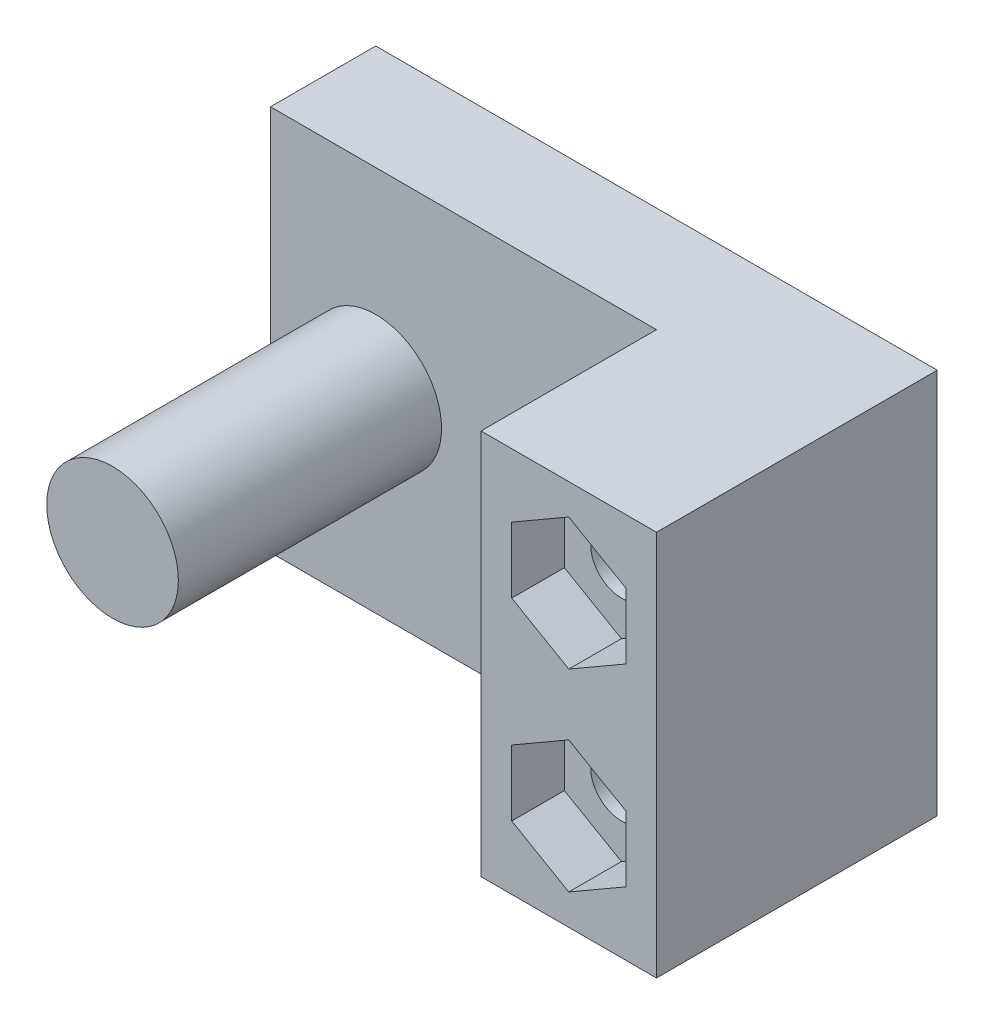
ISO-10303-21;
HEADER;
FILE_DESCRIPTION(('STEP AP214'),'2;1');
FILE_NAME('part.step','',(''),(''),'','','');
FILE_SCHEMA(('AUTOMOTIVE_DESIGN { 1 0 10303 214 1 1 1 1 }'));
ENDSEC;
DATA;
#1=APPLICATION_CONTEXT('core data for automotive mechanical design processes');
#2=APPLICATION_PROTOCOL_DEFINITION('international standard','automotive_design',2000,#1);
#3=PRODUCT_CONTEXT('',#1,'mechanical');
#4=PRODUCT('Part','Part','',(#3));
#5=PRODUCT_RELATED_PRODUCT_CATEGORY('part','',(#4));
#6=PRODUCT_DEFINITION_FORMATION('','',#4);
#7=PRODUCT_DEFINITION_CONTEXT('part definition',#1,'design');
#8=PRODUCT_DEFINITION('design','',#6,#7);
#9=PRODUCT_DEFINITION_SHAPE('','',#8);
#10=(LENGTH_UNIT() NAMED_UNIT(*) SI_UNIT(.MILLI.,.METRE.));
#11=(NAMED_UNIT(*) PLANE_ANGLE_UNIT() SI_UNIT($,.RADIAN.));
#12=(NAMED_UNIT(*) SI_UNIT($,.STERADIAN.) SOLID_ANGLE_UNIT());
#13=UNCERTAINTY_MEASURE_WITH_UNIT(LENGTH_MEASURE(1.E-05),#10,'distance_accuracy_value','');
#14=(GEOMETRIC_REPRESENTATION_CONTEXT(3) GLOBAL_UNCERTAINTY_ASSIGNED_CONTEXT((#13)) GLOBAL_UNIT_ASSIGNED_CONTEXT((#10,
#11,#12)) REPRESENTATION_CONTEXT('',''));
#15=CARTESIAN_POINT('',(0.,0.,0.));
#16=DIRECTION('',(0.,0.,1.));
#17=DIRECTION('',(1.,0.,0.));
#18=AXIS2_PLACEMENT_3D('',#15,#16,#17);
#19=CARTESIAN_POINT('',(13.,22.,6.));
#20=DIRECTION('',(0.,0.,-1.));
#21=DIRECTION('',(-1.,0.,0.));
#22=AXIS2_PLACEMENT_3D('',#19,#20,#21);
#23=PLANE('',#22);
#24=DIRECTION('',(1.,0.,0.));
#25=VECTOR('',#24,1.);
#26=CARTESIAN_POINT('',(13.,0.,6.));
#27=LINE('',#26,#25);
#28=CARTESIAN_POINT('',(-9.,0.,6.));
#29=VERTEX_POINT('',#28);
#30=CARTESIAN_POINT('',(13.,0.,6.));
#31=VERTEX_POINT('',#30);
#32=EDGE_CURVE('E293',#29,#31,#27,.T.);
#33=ORIENTED_EDGE('',*,*,#32,.T.);
#34=DIRECTION('',(0.,-1.,0.));
#35=VECTOR('',#34,1.);
#36=CARTESIAN_POINT('',(13.,22.,6.));
#37=LINE('',#36,#35);
#38=CARTESIAN_POINT('',(13.,22.,6.));
#39=VERTEX_POINT('',#38);
#40=EDGE_CURVE('E303',#39,#31,#37,.T.);
#41=ORIENTED_EDGE('',*,*,#40,.F.);
#42=DIRECTION('',(1.,0.,0.));
#43=VECTOR('',#42,1.);
#44=CARTESIAN_POINT('',(13.,22.,6.));
#45=LINE('',#44,#43);
#46=CARTESIAN_POINT('',(-9.,22.,6.));
#47=VERTEX_POINT('',#46);
#48=EDGE_CURVE('E280',#47,#39,#45,.T.);
#49=ORIENTED_EDGE('',*,*,#48,.F.);
#50=DIRECTION('',(0.,-1.,0.));
#51=VECTOR('',#50,1.);
#52=CARTESIAN_POINT('',(-9.,22.,6.));
#53=LINE('',#52,#51);
#54=EDGE_CURVE('E306',#47,#29,#53,.T.);
#55=ORIENTED_EDGE('',*,*,#54,.T.);
#56=EDGE_LOOP('',(#33,#41,#49,#55));
#57=FACE_BOUND('',#56,.T.);
#58=CARTESIAN_POINT('',(-3.,11.,6.));
#59=DIRECTION('',(0.,0.,-1.));
#60=DIRECTION('',(-1.,0.,0.));
#61=AXIS2_PLACEMENT_3D('',#58,#59,#60);
#62=CIRCLE('',#61,3.75);
#63=CARTESIAN_POINT('',(-6.75,11.,6.));
#64=VERTEX_POINT('',#63);
#65=EDGE_CURVE('E11',#64,#64,#62,.F.);
#66=ORIENTED_EDGE('',*,*,#65,.F.);
#67=EDGE_LOOP('',(#66));
#68=FACE_BOUND('',#67,.T.);
#69=ADVANCED_FACE('F33',(#57,#68),#23,.F.);
#70=CARTESIAN_POINT('',(23.,22.,0.));
#71=DIRECTION('',(-1.,0.,0.));
#72=DIRECTION('',(0.,0.,1.));
#73=AXIS2_PLACEMENT_3D('',#70,#71,#72);
#74=PLANE('',#73);
#75=DIRECTION('',(0.,0.,-1.));
#76=VECTOR('',#75,1.);
#77=CARTESIAN_POINT('',(23.,0.,0.));
#78=LINE('',#77,#76);
#79=CARTESIAN_POINT('',(23.,0.,16.));
#80=VERTEX_POINT('',#79);
#81=CARTESIAN_POINT('',(23.,0.,0.));
#82=VERTEX_POINT('',#81);
#83=EDGE_CURVE('E271',#80,#82,#78,.T.);
#84=ORIENTED_EDGE('',*,*,#83,.T.);
#85=DIRECTION('',(0.,-1.,0.));
#86=VECTOR('',#85,1.);
#87=CARTESIAN_POINT('',(23.,22.,0.));
#88=LINE('',#87,#86);
#89=CARTESIAN_POINT('',(23.,22.,0.));
#90=VERTEX_POINT('',#89);
#91=EDGE_CURVE('E42',#90,#82,#88,.T.);
#92=ORIENTED_EDGE('',*,*,#91,.F.);
#93=DIRECTION('',(0.,0.,-1.));
#94=VECTOR('',#93,1.);
#95=CARTESIAN_POINT('',(23.,22.,0.));
#96=LINE('',#95,#94);
#97=CARTESIAN_POINT('',(23.,22.,16.));
#98=VERTEX_POINT('',#97);
#99=EDGE_CURVE('E272',#98,#90,#96,.T.);
#100=ORIENTED_EDGE('',*,*,#99,.F.);
#101=DIRECTION('',(0.,-1.,0.));
#102=VECTOR('',#101,1.);
#103=CARTESIAN_POINT('',(23.,22.,16.));
#104=LINE('',#103,#102);
#105=EDGE_CURVE('E286',#98,#80,#104,.T.);
#106=ORIENTED_EDGE('',*,*,#105,.T.);
#107=EDGE_LOOP('',(#84,#92,#100,#106));
#108=FACE_BOUND('',#107,.T.);
#109=ADVANCED_FACE('F35',(#108),#74,.F.);
#110=CARTESIAN_POINT('',(23.,22.,0.));
#111=DIRECTION('',(0.,0.,1.));
#112=DIRECTION('',(1.,0.,0.));
#113=AXIS2_PLACEMENT_3D('',#110,#111,#112);
#114=PLANE('',#113);
#115=DIRECTION('',(-1.,0.,0.));
#116=VECTOR('',#115,1.);
#117=CARTESIAN_POINT('',(23.,0.,0.));
#118=LINE('',#117,#116);
#119=CARTESIAN_POINT('',(-9.,0.,0.));
#120=VERTEX_POINT('',#119);
#121=EDGE_CURVE('E289',#82,#120,#118,.T.);
#122=ORIENTED_EDGE('',*,*,#121,.T.);
#123=DIRECTION('',(0.,-1.,0.));
#124=VECTOR('',#123,1.);
#125=CARTESIAN_POINT('',(-9.,22.,0.));
#126=LINE('',#125,#124);
#127=CARTESIAN_POINT('',(-9.,22.,0.));
#128=VERTEX_POINT('',#127);
#129=EDGE_CURVE('E309',#128,#120,#126,.T.);
#130=ORIENTED_EDGE('',*,*,#129,.F.);
#131=DIRECTION('',(-1.,0.,0.));
#132=VECTOR('',#131,1.);
#133=CARTESIAN_POINT('',(23.,22.,0.));
#134=LINE('',#133,#132);
#135=EDGE_CURVE('E275',#90,#128,#134,.T.);
#136=ORIENTED_EDGE('',*,*,#135,.F.);
#137=ORIENTED_EDGE('',*,*,#91,.T.);
#138=EDGE_LOOP('',(#122,#130,#136,#137));
#139=FACE_BOUND('',#138,.T.);
#140=ADVANCED_FACE('F339',(#139),#114,.F.);
#141=CARTESIAN_POINT('',(-9.,22.,0.));
#142=DIRECTION('',(1.,0.,0.));
#143=DIRECTION('',(0.,0.,-1.));
#144=AXIS2_PLACEMENT_3D('',#141,#142,#143);
#145=PLANE('',#144);
#146=DIRECTION('',(0.,0.,1.));
#147=VECTOR('',#146,1.);
#148=CARTESIAN_POINT('',(-9.,0.,0.));
#149=LINE('',#148,#147);
#150=EDGE_CURVE('E291',#120,#29,#149,.T.);
#151=ORIENTED_EDGE('',*,*,#150,.T.);
#152=ORIENTED_EDGE('',*,*,#54,.F.);
#153=DIRECTION('',(0.,0.,1.));
#154=VECTOR('',#153,1.);
#155=CARTESIAN_POINT('',(-9.,22.,0.));
#156=LINE('',#155,#154);
#157=EDGE_CURVE('E278',#128,#47,#156,.T.);
#158=ORIENTED_EDGE('',*,*,#157,.F.);
#159=ORIENTED_EDGE('',*,*,#129,.T.);
#160=EDGE_LOOP('',(#151,#152,#158,#159));
#161=FACE_BOUND('',#160,.T.);
#162=ADVANCED_FACE('F346',(#161),#145,.F.);
#163=CARTESIAN_POINT('',(13.,22.,16.));
#164=DIRECTION('',(1.,0.,0.));
#165=DIRECTION('',(0.,0.,-1.));
#166=AXIS2_PLACEMENT_3D('',#163,#164,#165);
#167=PLANE('',#166);
#168=DIRECTION('',(0.,0.,1.));
#169=VECTOR('',#168,1.);
#170=CARTESIAN_POINT('',(13.,0.,16.));
#171=LINE('',#170,#169);
#172=CARTESIAN_POINT('',(13.,0.,16.));
#173=VERTEX_POINT('',#172);
#174=EDGE_CURVE('E295',#31,#173,#171,.T.);
#175=ORIENTED_EDGE('',*,*,#174,.T.);
#176=DIRECTION('',(0.,-1.,0.));
#177=VECTOR('',#176,1.);
#178=CARTESIAN_POINT('',(13.,22.,16.));
#179=LINE('',#178,#177);
#180=CARTESIAN_POINT('',(13.,22.,16.));
#181=VERTEX_POINT('',#180);
#182=EDGE_CURVE('E300',#181,#173,#179,.T.);
#183=ORIENTED_EDGE('',*,*,#182,.F.);
#184=DIRECTION('',(0.,0.,1.));
#185=VECTOR('',#184,1.);
#186=CARTESIAN_POINT('',(13.,22.,16.));
#187=LINE('',#186,#185);
#188=EDGE_CURVE('E282',#39,#181,#187,.T.);
#189=ORIENTED_EDGE('',*,*,#188,.F.);
#190=ORIENTED_EDGE('',*,*,#40,.T.);
#191=EDGE_LOOP('',(#175,#183,#189,#190));
#192=FACE_BOUND('',#191,.T.);
#193=ADVANCED_FACE('F344',(#192),#167,.F.);
#194=CARTESIAN_POINT('',(23.,22.,16.));
#195=DIRECTION('',(0.,0.,-1.));
#196=DIRECTION('',(-1.,0.,0.));
#197=AXIS2_PLACEMENT_3D('',#194,#195,#196);
#198=PLANE('',#197);
#199=DIRECTION('',(0.,1.,0.));
#200=VECTOR('',#199,1.);
#201=CARTESIAN_POINT('',(21.25,3.62361162513372,16.));
#202=LINE('',#201,#200);
#203=CARTESIAN_POINT('',(21.25,3.62361162513372,16.));
#204=VERTEX_POINT('',#203);
#205=CARTESIAN_POINT('',(21.25,7.37638837486628,16.));
#206=VERTEX_POINT('',#205);
#207=EDGE_CURVE('E196',#204,#206,#202,.T.);
#208=ORIENTED_EDGE('',*,*,#207,.F.);
#209=DIRECTION('',(0.866025403784438,0.5,0.));
#210=VECTOR('',#209,1.);
#211=CARTESIAN_POINT('',(18.,1.74722325026744,16.));
#212=LINE('',#211,#210);
#213=CARTESIAN_POINT('',(18.,1.74722325026744,16.));
#214=VERTEX_POINT('',#213);
#215=EDGE_CURVE('E50',#214,#204,#212,.T.);
#216=ORIENTED_EDGE('',*,*,#215,.F.);
#217=DIRECTION('',(0.866025403784439,-0.5,0.));
#218=VECTOR('',#217,1.);
#219=CARTESIAN_POINT('',(14.75,3.62361162513372,16.));
#220=LINE('',#219,#218);
#221=CARTESIAN_POINT('',(14.75,3.62361162513372,16.));
#222=VERTEX_POINT('',#221);
#223=EDGE_CURVE('E182',#222,#214,#220,.T.);
#224=ORIENTED_EDGE('',*,*,#223,.F.);
#225=DIRECTION('',(0.,-1.,0.));
#226=VECTOR('',#225,1.);
#227=CARTESIAN_POINT('',(14.75,7.37638837486628,16.));
#228=LINE('',#227,#226);
#229=CARTESIAN_POINT('',(14.75,7.37638837486628,16.));
#230=VERTEX_POINT('',#229);
#231=EDGE_CURVE('E185',#230,#222,#228,.T.);
#232=ORIENTED_EDGE('',*,*,#231,.F.);
#233=DIRECTION('',(-0.866025403784438,-0.5,0.));
#234=VECTOR('',#233,1.);
#235=CARTESIAN_POINT('',(18.,9.25277674973256,16.));
#236=LINE('',#235,#234);
#237=CARTESIAN_POINT('',(18.,9.25277674973256,16.));
#238=VERTEX_POINT('',#237);
#239=EDGE_CURVE('E201',#238,#230,#236,.T.);
#240=ORIENTED_EDGE('',*,*,#239,.F.);
#241=DIRECTION('',(-0.866025403784439,0.5,0.));
#242=VECTOR('',#241,1.);
#243=CARTESIAN_POINT('',(21.25,7.37638837486628,16.));
#244=LINE('',#243,#242);
#245=EDGE_CURVE('E198',#206,#238,#244,.T.);
#246=ORIENTED_EDGE('',*,*,#245,.F.);
#247=EDGE_LOOP('',(#208,#216,#224,#232,#240,#246));
#248=FACE_BOUND('',#247,.T.);
#249=DIRECTION('',(0.,1.,0.));
#250=VECTOR('',#249,1.);
#251=CARTESIAN_POINT('',(21.25,14.6236116251337,16.));
#252=LINE('',#251,#250);
#253=CARTESIAN_POINT('',(21.25,14.6236116251337,16.));
#254=VERTEX_POINT('',#253);
#255=CARTESIAN_POINT('',(21.25,18.3763883748663,16.));
#256=VERTEX_POINT('',#255);
#257=EDGE_CURVE('E236',#254,#256,#252,.T.);
#258=ORIENTED_EDGE('',*,*,#257,.F.);
#259=DIRECTION('',(0.866025403784439,0.5,0.));
#260=VECTOR('',#259,1.);
#261=CARTESIAN_POINT('',(18.,12.7472232502674,16.));
#262=LINE('',#261,#260);
#263=CARTESIAN_POINT('',(18.,12.7472232502674,16.));
#264=VERTEX_POINT('',#263);
#265=EDGE_CURVE('E58',#264,#254,#262,.T.);
#266=ORIENTED_EDGE('',*,*,#265,.F.);
#267=DIRECTION('',(0.866025403784439,-0.5,0.));
#268=VECTOR('',#267,1.);
#269=CARTESIAN_POINT('',(14.75,14.6236116251337,16.));
#270=LINE('',#269,#268);
#271=CARTESIAN_POINT('',(14.75,14.6236116251337,16.));
#272=VERTEX_POINT('',#271);
#273=EDGE_CURVE('E219',#272,#264,#270,.T.);
#274=ORIENTED_EDGE('',*,*,#273,.F.);
#275=DIRECTION('',(0.,-1.,0.));
#276=VECTOR('',#275,1.);
#277=CARTESIAN_POINT('',(14.75,18.3763883748663,16.));
#278=LINE('',#277,#276);
#279=CARTESIAN_POINT('',(14.75,18.3763883748663,16.));
#280=VERTEX_POINT('',#279);
#281=EDGE_CURVE('E245',#280,#272,#278,.T.);
#282=ORIENTED_EDGE('',*,*,#281,.F.);
#283=DIRECTION('',(-0.866025403784439,-0.5,0.));
#284=VECTOR('',#283,1.);
#285=CARTESIAN_POINT('',(18.,20.2527767497326,16.));
#286=LINE('',#285,#284);
#287=CARTESIAN_POINT('',(18.,20.2527767497326,16.));
#288=VERTEX_POINT('',#287);
#289=EDGE_CURVE('E242',#288,#280,#286,.T.);
#290=ORIENTED_EDGE('',*,*,#289,.F.);
#291=DIRECTION('',(-0.866025403784439,0.499999999999999,0.));
#292=VECTOR('',#291,1.);
#293=CARTESIAN_POINT('',(21.25,18.3763883748663,16.));
#294=LINE('',#293,#292);
#295=EDGE_CURVE('E239',#256,#288,#294,.T.);
#296=ORIENTED_EDGE('',*,*,#295,.F.);
#297=EDGE_LOOP('',(#258,#266,#274,#282,#290,#296));
#298=FACE_BOUND('',#297,.T.);
#299=DIRECTION('',(1.,0.,0.));
#300=VECTOR('',#299,1.);
#301=CARTESIAN_POINT('',(23.,0.,16.));
#302=LINE('',#301,#300);
#303=EDGE_CURVE('E276',#173,#80,#302,.T.);
#304=ORIENTED_EDGE('',*,*,#303,.T.);
#305=ORIENTED_EDGE('',*,*,#105,.F.);
#306=DIRECTION('',(1.,0.,0.));
#307=VECTOR('',#306,1.);
#308=CARTESIAN_POINT('',(23.,22.,16.));
#309=LINE('',#308,#307);
#310=EDGE_CURVE('E284',#181,#98,#309,.T.);
#311=ORIENTED_EDGE('',*,*,#310,.F.);
#312=ORIENTED_EDGE('',*,*,#182,.T.);
#313=EDGE_LOOP('',(#304,#305,#311,#312));
#314=FACE_BOUND('',#313,.T.);
#315=ADVANCED_FACE('F375',(#248,#298,#314),#198,.F.);
#316=CARTESIAN_POINT('',(0.,22.,0.));
#317=DIRECTION('',(0.,-1.,0.));
#318=DIRECTION('',(0.,0.,-1.));
#319=AXIS2_PLACEMENT_3D('',#316,#317,#318);
#320=PLANE('',#319);
#321=ORIENTED_EDGE('',*,*,#99,.T.);
#322=ORIENTED_EDGE('',*,*,#135,.T.);
#323=ORIENTED_EDGE('',*,*,#157,.T.);
#324=ORIENTED_EDGE('',*,*,#48,.T.);
#325=ORIENTED_EDGE('',*,*,#188,.T.);
#326=ORIENTED_EDGE('',*,*,#310,.T.);
#327=EDGE_LOOP('',(#321,#322,#323,#324,#325,#326));
#328=FACE_BOUND('',#327,.T.);
#329=ADVANCED_FACE('F371',(#328),#320,.F.);
#330=CARTESIAN_POINT('',(0.,0.,0.));
#331=DIRECTION('',(0.,-1.,0.));
#332=DIRECTION('',(0.,0.,-1.));
#333=AXIS2_PLACEMENT_3D('',#330,#331,#332);
#334=PLANE('',#333);
#335=ORIENTED_EDGE('',*,*,#83,.F.);
#336=ORIENTED_EDGE('',*,*,#303,.F.);
#337=ORIENTED_EDGE('',*,*,#174,.F.);
#338=ORIENTED_EDGE('',*,*,#32,.F.);
#339=ORIENTED_EDGE('',*,*,#150,.F.);
#340=ORIENTED_EDGE('',*,*,#121,.F.);
#341=EDGE_LOOP('',(#335,#336,#337,#338,#339,#340));
#342=FACE_BOUND('',#341,.T.);
#343=ADVANCED_FACE('F361',(#342),#334,.T.);
#344=CARTESIAN_POINT('',(-3.,11.,21.));
#345=DIRECTION('',(0.,0.,-1.));
#346=DIRECTION('',(-1.,0.,0.));
#347=AXIS2_PLACEMENT_3D('',#344,#345,#346);
#348=CYLINDRICAL_SURFACE('',#347,3.75);
#349=CARTESIAN_POINT('',(-3.,11.,21.));
#350=DIRECTION('',(0.,0.,1.));
#351=DIRECTION('',(1.,0.,0.));
#352=AXIS2_PLACEMENT_3D('',#349,#350,#351);
#353=CIRCLE('',#352,3.75);
#354=CARTESIAN_POINT('',(0.749999999999998,11.,21.));
#355=VERTEX_POINT('',#354);
#356=EDGE_CURVE('E268',#355,#355,#353,.T.);
#357=ORIENTED_EDGE('',*,*,#356,.F.);
#358=EDGE_LOOP('',(#357));
#359=FACE_BOUND('',#358,.T.);
#360=ORIENTED_EDGE('',*,*,#65,.T.);
#361=EDGE_LOOP('',(#360));
#362=FACE_BOUND('',#361,.T.);
#363=ADVANCED_FACE('F386',(#359,#362),#348,.T.);
#364=CARTESIAN_POINT('',(-3.,11.,21.));
#365=DIRECTION('',(0.,0.,1.));
#366=DIRECTION('',(1.,0.,0.));
#367=AXIS2_PLACEMENT_3D('',#364,#365,#366);
#368=PLANE('',#367);
#369=ORIENTED_EDGE('',*,*,#356,.T.);
#370=EDGE_LOOP('',(#369));
#371=FACE_BOUND('',#370,.T.);
#372=ADVANCED_FACE('F389',(#371),#368,.T.);
#373=CARTESIAN_POINT('',(0.,0.,13.));
#374=DIRECTION('',(0.,0.,1.));
#375=DIRECTION('',(1.,0.,0.));
#376=AXIS2_PLACEMENT_3D('',#373,#374,#375);
#377=PLANE('',#376);
#378=DIRECTION('',(0.866025403784439,0.5,0.));
#379=VECTOR('',#378,1.);
#380=CARTESIAN_POINT('',(18.,12.7472232502674,13.));
#381=LINE('',#380,#379);
#382=CARTESIAN_POINT('',(18.,12.7472232502674,13.));
#383=VERTEX_POINT('',#382);
#384=CARTESIAN_POINT('',(21.25,14.6236116251337,13.));
#385=VERTEX_POINT('',#384);
#386=EDGE_CURVE('E215',#383,#385,#381,.T.);
#387=ORIENTED_EDGE('',*,*,#386,.T.);
#388=DIRECTION('',(0.,1.,0.));
#389=VECTOR('',#388,1.);
#390=CARTESIAN_POINT('',(21.25,14.6236116251337,13.));
#391=LINE('',#390,#389);
#392=CARTESIAN_POINT('',(21.25,18.3763883748663,13.));
#393=VERTEX_POINT('',#392);
#394=EDGE_CURVE('E218',#385,#393,#391,.T.);
#395=ORIENTED_EDGE('',*,*,#394,.T.);
#396=DIRECTION('',(-0.866025403784439,0.499999999999999,0.));
#397=VECTOR('',#396,1.);
#398=CARTESIAN_POINT('',(21.25,18.3763883748663,13.));
#399=LINE('',#398,#397);
#400=CARTESIAN_POINT('',(18.,20.2527767497326,13.));
#401=VERTEX_POINT('',#400);
#402=EDGE_CURVE('E222',#393,#401,#399,.T.);
#403=ORIENTED_EDGE('',*,*,#402,.T.);
#404=DIRECTION('',(-0.866025403784439,-0.5,0.));
#405=VECTOR('',#404,1.);
#406=CARTESIAN_POINT('',(18.,20.2527767497326,13.));
#407=LINE('',#406,#405);
#408=CARTESIAN_POINT('',(14.75,18.3763883748663,13.));
#409=VERTEX_POINT('',#408);
#410=EDGE_CURVE('E225',#401,#409,#407,.T.);
#411=ORIENTED_EDGE('',*,*,#410,.T.);
#412=DIRECTION('',(0.,-1.,0.));
#413=VECTOR('',#412,1.);
#414=CARTESIAN_POINT('',(14.75,18.3763883748663,13.));
#415=LINE('',#414,#413);
#416=CARTESIAN_POINT('',(14.75,14.6236116251337,13.));
#417=VERTEX_POINT('',#416);
#418=EDGE_CURVE('E228',#409,#417,#415,.T.);
#419=ORIENTED_EDGE('',*,*,#418,.T.);
#420=DIRECTION('',(0.866025403784439,-0.5,0.));
#421=VECTOR('',#420,1.);
#422=CARTESIAN_POINT('',(14.75,14.6236116251337,13.));
#423=LINE('',#422,#421);
#424=EDGE_CURVE('E231',#417,#383,#423,.T.);
#425=ORIENTED_EDGE('',*,*,#424,.T.);
#426=EDGE_LOOP('',(#387,#395,#403,#411,#419,#425));
#427=FACE_BOUND('',#426,.T.);
#428=CARTESIAN_POINT('',(18.,16.5,13.));
#429=DIRECTION('',(0.,0.,1.));
#430=DIRECTION('',(1.,0.,0.));
#431=AXIS2_PLACEMENT_3D('',#428,#429,#430);
#432=CIRCLE('',#431,1.75);
#433=CARTESIAN_POINT('',(19.75,16.5,13.));
#434=VERTEX_POINT('',#433);
#435=EDGE_CURVE('E252',#434,#434,#432,.F.);
#436=ORIENTED_EDGE('',*,*,#435,.T.);
#437=EDGE_LOOP('',(#436));
#438=FACE_BOUND('',#437,.T.);
#439=ADVANCED_FACE('F316',(#427,#438),#377,.T.);
#440=CARTESIAN_POINT('',(18.,12.7472232502674,13.));
#441=DIRECTION('',(0.5,-0.866025403784439,0.));
#442=DIRECTION('',(0.866025403784439,0.5,0.));
#443=AXIS2_PLACEMENT_3D('',#440,#441,#442);
#444=PLANE('',#443);
#445=ORIENTED_EDGE('',*,*,#265,.T.);
#446=DIRECTION('',(0.,0.,1.));
#447=VECTOR('',#446,1.);
#448=CARTESIAN_POINT('',(21.25,14.6236116251337,13.));
#449=LINE('',#448,#447);
#450=EDGE_CURVE('E234',#385,#254,#449,.T.);
#451=ORIENTED_EDGE('',*,*,#450,.F.);
#452=ORIENTED_EDGE('',*,*,#386,.F.);
#453=DIRECTION('',(0.,0.,1.));
#454=VECTOR('',#453,1.);
#455=CARTESIAN_POINT('',(18.,12.7472232502674,13.));
#456=LINE('',#455,#454);
#457=EDGE_CURVE('E250',#383,#264,#456,.T.);
#458=ORIENTED_EDGE('',*,*,#457,.T.);
#459=EDGE_LOOP('',(#445,#451,#452,#458));
#460=FACE_BOUND('',#459,.T.);
#461=ADVANCED_FACE('F396',(#460),#444,.F.);
#462=CARTESIAN_POINT('',(14.75,14.6236116251337,13.));
#463=DIRECTION('',(-0.5,-0.866025403784438,0.));
#464=DIRECTION('',(0.866025403784439,-0.5,0.));
#465=AXIS2_PLACEMENT_3D('',#462,#463,#464);
#466=PLANE('',#465);
#467=ORIENTED_EDGE('',*,*,#273,.T.);
#468=ORIENTED_EDGE('',*,*,#457,.F.);
#469=ORIENTED_EDGE('',*,*,#424,.F.);
#470=DIRECTION('',(0.,0.,1.));
#471=VECTOR('',#470,1.);
#472=CARTESIAN_POINT('',(14.75,14.6236116251337,13.));
#473=LINE('',#472,#471);
#474=EDGE_CURVE('E253',#417,#272,#473,.T.);
#475=ORIENTED_EDGE('',*,*,#474,.T.);
#476=EDGE_LOOP('',(#467,#468,#469,#475));
#477=FACE_BOUND('',#476,.T.);
#478=ADVANCED_FACE('F405',(#477),#466,.F.);
#479=CARTESIAN_POINT('',(14.75,18.3763883748663,13.));
#480=DIRECTION('',(-1.,0.,0.));
#481=DIRECTION('',(0.,0.,1.));
#482=AXIS2_PLACEMENT_3D('',#479,#480,#481);
#483=PLANE('',#482);
#484=ORIENTED_EDGE('',*,*,#281,.T.);
#485=ORIENTED_EDGE('',*,*,#474,.F.);
#486=ORIENTED_EDGE('',*,*,#418,.F.);
#487=DIRECTION('',(0.,0.,1.));
#488=VECTOR('',#487,1.);
#489=CARTESIAN_POINT('',(14.75,18.3763883748663,13.));
#490=LINE('',#489,#488);
#491=EDGE_CURVE('E255',#409,#280,#490,.T.);
#492=ORIENTED_EDGE('',*,*,#491,.T.);
#493=EDGE_LOOP('',(#484,#485,#486,#492));
#494=FACE_BOUND('',#493,.T.);
#495=ADVANCED_FACE('F412',(#494),#483,.F.);
#496=CARTESIAN_POINT('',(18.,20.2527767497326,13.));
#497=DIRECTION('',(-0.5,0.866025403784439,0.));
#498=DIRECTION('',(-0.866025403784439,-0.5,0.));
#499=AXIS2_PLACEMENT_3D('',#496,#497,#498);
#500=PLANE('',#499);
#501=ORIENTED_EDGE('',*,*,#289,.T.);
#502=ORIENTED_EDGE('',*,*,#491,.F.);
#503=ORIENTED_EDGE('',*,*,#410,.F.);
#504=DIRECTION('',(0.,0.,1.));
#505=VECTOR('',#504,1.);
#506=CARTESIAN_POINT('',(18.,20.2527767497326,13.));
#507=LINE('',#506,#505);
#508=EDGE_CURVE('E257',#401,#288,#507,.T.);
#509=ORIENTED_EDGE('',*,*,#508,.T.);
#510=EDGE_LOOP('',(#501,#502,#503,#509));
#511=FACE_BOUND('',#510,.T.);
#512=ADVANCED_FACE('F416',(#511),#500,.F.);
#513=CARTESIAN_POINT('',(21.25,18.3763883748663,13.));
#514=DIRECTION('',(0.499999999999999,0.866025403784439,0.));
#515=DIRECTION('',(-0.866025403784439,0.499999999999999,0.));
#516=AXIS2_PLACEMENT_3D('',#513,#514,#515);
#517=PLANE('',#516);
#518=ORIENTED_EDGE('',*,*,#295,.T.);
#519=ORIENTED_EDGE('',*,*,#508,.F.);
#520=ORIENTED_EDGE('',*,*,#402,.F.);
#521=DIRECTION('',(0.,0.,1.));
#522=VECTOR('',#521,1.);
#523=CARTESIAN_POINT('',(21.25,18.3763883748663,13.));
#524=LINE('',#523,#522);
#525=EDGE_CURVE('E259',#393,#256,#524,.T.);
#526=ORIENTED_EDGE('',*,*,#525,.T.);
#527=EDGE_LOOP('',(#518,#519,#520,#526));
#528=FACE_BOUND('',#527,.T.);
#529=ADVANCED_FACE('F420',(#528),#517,.F.);
#530=CARTESIAN_POINT('',(21.25,14.6236116251337,13.));
#531=DIRECTION('',(1.,0.,0.));
#532=DIRECTION('',(0.,0.,-1.));
#533=AXIS2_PLACEMENT_3D('',#530,#531,#532);
#534=PLANE('',#533);
#535=ORIENTED_EDGE('',*,*,#257,.T.);
#536=ORIENTED_EDGE('',*,*,#525,.F.);
#537=ORIENTED_EDGE('',*,*,#394,.F.);
#538=ORIENTED_EDGE('',*,*,#450,.T.);
#539=EDGE_LOOP('',(#535,#536,#537,#538));
#540=FACE_BOUND('',#539,.T.);
#541=ADVANCED_FACE('F328',(#540),#534,.F.);
#542=CARTESIAN_POINT('',(18.,16.5,10.));
#543=DIRECTION('',(0.,0.,1.));
#544=DIRECTION('',(1.,0.,0.));
#545=AXIS2_PLACEMENT_3D('',#542,#543,#544);
#546=PLANE('',#545);
#547=CARTESIAN_POINT('',(18.,16.5,10.));
#548=DIRECTION('',(0.,0.,1.));
#549=DIRECTION('',(1.,0.,0.));
#550=AXIS2_PLACEMENT_3D('',#547,#548,#549);
#551=CIRCLE('',#550,1.75);
#552=CARTESIAN_POINT('',(19.75,16.5,10.));
#553=VERTEX_POINT('',#552);
#554=EDGE_CURVE('E265',#553,#553,#551,.T.);
#555=ORIENTED_EDGE('',*,*,#554,.T.);
#556=EDGE_LOOP('',(#555));
#557=FACE_BOUND('',#556,.T.);
#558=ADVANCED_FACE('F320',(#557),#546,.T.);
#559=CARTESIAN_POINT('',(18.,16.5,10.));
#560=DIRECTION('',(0.,0.,1.));
#561=DIRECTION('',(1.,0.,0.));
#562=AXIS2_PLACEMENT_3D('',#559,#560,#561);
#563=CYLINDRICAL_SURFACE('',#562,1.75);
#564=ORIENTED_EDGE('',*,*,#554,.F.);
#565=EDGE_LOOP('',(#564));
#566=FACE_BOUND('',#565,.T.);
#567=ORIENTED_EDGE('',*,*,#435,.F.);
#568=EDGE_LOOP('',(#567));
#569=FACE_BOUND('',#568,.T.);
#570=ADVANCED_FACE('F318',(#566,#569),#563,.F.);
#571=CARTESIAN_POINT('',(0.,0.,13.));
#572=DIRECTION('',(0.,0.,1.));
#573=DIRECTION('',(1.,0.,0.));
#574=AXIS2_PLACEMENT_3D('',#571,#572,#573);
#575=PLANE('',#574);
#576=DIRECTION('',(0.866025403784438,0.5,0.));
#577=VECTOR('',#576,1.);
#578=CARTESIAN_POINT('',(18.,1.74722325026744,13.));
#579=LINE('',#578,#577);
#580=CARTESIAN_POINT('',(18.,1.74722325026744,13.));
#581=VERTEX_POINT('',#580);
#582=CARTESIAN_POINT('',(21.25,3.62361162513372,13.));
#583=VERTEX_POINT('',#582);
#584=EDGE_CURVE('E162',#581,#583,#579,.T.);
#585=ORIENTED_EDGE('',*,*,#584,.T.);
#586=DIRECTION('',(0.,1.,0.));
#587=VECTOR('',#586,1.);
#588=CARTESIAN_POINT('',(21.25,3.62361162513372,13.));
#589=LINE('',#588,#587);
#590=CARTESIAN_POINT('',(21.25,7.37638837486628,13.));
#591=VERTEX_POINT('',#590);
#592=EDGE_CURVE('E171',#583,#591,#589,.T.);
#593=ORIENTED_EDGE('',*,*,#592,.T.);
#594=DIRECTION('',(-0.866025403784439,0.5,0.));
#595=VECTOR('',#594,1.);
#596=CARTESIAN_POINT('',(21.25,7.37638837486628,13.));
#597=LINE('',#596,#595);
#598=CARTESIAN_POINT('',(18.,9.25277674973256,13.));
#599=VERTEX_POINT('',#598);
#600=EDGE_CURVE('E176',#591,#599,#597,.T.);
#601=ORIENTED_EDGE('',*,*,#600,.T.);
#602=DIRECTION('',(-0.866025403784438,-0.5,0.));
#603=VECTOR('',#602,1.);
#604=CARTESIAN_POINT('',(18.,9.25277674973256,13.));
#605=LINE('',#604,#603);
#606=CARTESIAN_POINT('',(14.75,7.37638837486628,13.));
#607=VERTEX_POINT('',#606);
#608=EDGE_CURVE('E189',#599,#607,#605,.T.);
#609=ORIENTED_EDGE('',*,*,#608,.T.);
#610=DIRECTION('',(0.,-1.,0.));
#611=VECTOR('',#610,1.);
#612=CARTESIAN_POINT('',(14.75,7.37638837486628,13.));
#613=LINE('',#612,#611);
#614=CARTESIAN_POINT('',(14.75,3.62361162513372,13.));
#615=VERTEX_POINT('',#614);
#616=EDGE_CURVE('E192',#607,#615,#613,.T.);
#617=ORIENTED_EDGE('',*,*,#616,.T.);
#618=DIRECTION('',(0.866025403784439,-0.5,0.));
#619=VECTOR('',#618,1.);
#620=CARTESIAN_POINT('',(14.75,3.62361162513372,13.));
#621=LINE('',#620,#619);
#622=EDGE_CURVE('E168',#615,#581,#621,.T.);
#623=ORIENTED_EDGE('',*,*,#622,.T.);
#624=EDGE_LOOP('',(#585,#593,#601,#609,#617,#623));
#625=FACE_BOUND('',#624,.T.);
#626=CARTESIAN_POINT('',(18.,5.5,13.));
#627=DIRECTION('',(0.,0.,1.));
#628=DIRECTION('',(1.,0.,0.));
#629=AXIS2_PLACEMENT_3D('',#626,#627,#628);
#630=CIRCLE('',#629,1.75);
#631=CARTESIAN_POINT('',(19.75,5.5,13.));
#632=VERTEX_POINT('',#631);
#633=EDGE_CURVE('E37',#632,#632,#630,.F.);
#634=ORIENTED_EDGE('',*,*,#633,.T.);
#635=EDGE_LOOP('',(#634));
#636=FACE_BOUND('',#635,.T.);
#637=ADVANCED_FACE('F178',(#625,#636),#575,.T.);
#638=CARTESIAN_POINT('',(18.,1.74722325026744,13.));
#639=DIRECTION('',(0.5,-0.866025403784438,0.));
#640=DIRECTION('',(0.866025403784438,0.5,0.));
#641=AXIS2_PLACEMENT_3D('',#638,#639,#640);
#642=PLANE('',#641);
#643=ORIENTED_EDGE('',*,*,#215,.T.);
#644=DIRECTION('',(0.,0.,1.));
#645=VECTOR('',#644,1.);
#646=CARTESIAN_POINT('',(21.25,3.62361162513372,13.));
#647=LINE('',#646,#645);
#648=EDGE_CURVE('E158',#583,#204,#647,.T.);
#649=ORIENTED_EDGE('',*,*,#648,.F.);
#650=ORIENTED_EDGE('',*,*,#584,.F.);
#651=DIRECTION('',(0.,0.,1.));
#652=VECTOR('',#651,1.);
#653=CARTESIAN_POINT('',(18.,1.74722325026744,13.));
#654=LINE('',#653,#652);
#655=EDGE_CURVE('E206',#581,#214,#654,.T.);
#656=ORIENTED_EDGE('',*,*,#655,.T.);
#657=EDGE_LOOP('',(#643,#649,#650,#656));
#658=FACE_BOUND('',#657,.T.);
#659=ADVANCED_FACE('F160',(#658),#642,.F.);
#660=CARTESIAN_POINT('',(14.75,3.62361162513372,13.));
#661=DIRECTION('',(-0.5,-0.866025403784439,0.));
#662=DIRECTION('',(0.866025403784439,-0.5,0.));
#663=AXIS2_PLACEMENT_3D('',#660,#661,#662);
#664=PLANE('',#663);
#665=ORIENTED_EDGE('',*,*,#223,.T.);
#666=ORIENTED_EDGE('',*,*,#655,.F.);
#667=ORIENTED_EDGE('',*,*,#622,.F.);
#668=DIRECTION('',(0.,0.,1.));
#669=VECTOR('',#668,1.);
#670=CARTESIAN_POINT('',(14.75,3.62361162513372,13.));
#671=LINE('',#670,#669);
#672=EDGE_CURVE('E208',#615,#222,#671,.T.);
#673=ORIENTED_EDGE('',*,*,#672,.T.);
#674=EDGE_LOOP('',(#665,#666,#667,#673));
#675=FACE_BOUND('',#674,.T.);
#676=ADVANCED_FACE('F474',(#675),#664,.F.);
#677=CARTESIAN_POINT('',(14.75,7.37638837486628,13.));
#678=DIRECTION('',(-1.,0.,0.));
#679=DIRECTION('',(0.,0.,1.));
#680=AXIS2_PLACEMENT_3D('',#677,#678,#679);
#681=PLANE('',#680);
#682=ORIENTED_EDGE('',*,*,#231,.T.);
#683=ORIENTED_EDGE('',*,*,#672,.F.);
#684=ORIENTED_EDGE('',*,*,#616,.F.);
#685=DIRECTION('',(0.,0.,1.));
#686=VECTOR('',#685,1.);
#687=CARTESIAN_POINT('',(14.75,7.37638837486628,13.));
#688=LINE('',#687,#686);
#689=EDGE_CURVE('E210',#607,#230,#688,.T.);
#690=ORIENTED_EDGE('',*,*,#689,.T.);
#691=EDGE_LOOP('',(#682,#683,#684,#690));
#692=FACE_BOUND('',#691,.T.);
#693=ADVANCED_FACE('F466',(#692),#681,.F.);
#694=CARTESIAN_POINT('',(18.,9.25277674973256,13.));
#695=DIRECTION('',(-0.5,0.866025403784439,0.));
#696=DIRECTION('',(-0.866025403784439,-0.5,0.));
#697=AXIS2_PLACEMENT_3D('',#694,#695,#696);
#698=PLANE('',#697);
#699=ORIENTED_EDGE('',*,*,#239,.T.);
#700=ORIENTED_EDGE('',*,*,#689,.F.);
#701=ORIENTED_EDGE('',*,*,#608,.F.);
#702=DIRECTION('',(0.,0.,1.));
#703=VECTOR('',#702,1.);
#704=CARTESIAN_POINT('',(18.,9.25277674973256,13.));
#705=LINE('',#704,#703);
#706=EDGE_CURVE('E212',#599,#238,#705,.T.);
#707=ORIENTED_EDGE('',*,*,#706,.T.);
#708=EDGE_LOOP('',(#699,#700,#701,#707));
#709=FACE_BOUND('',#708,.T.);
#710=ADVANCED_FACE('F458',(#709),#698,.F.);
#711=CARTESIAN_POINT('',(21.25,7.37638837486628,13.));
#712=DIRECTION('',(0.5,0.866025403784439,0.));
#713=DIRECTION('',(-0.866025403784439,0.5,0.));
#714=AXIS2_PLACEMENT_3D('',#711,#712,#713);
#715=PLANE('',#714);
#716=ORIENTED_EDGE('',*,*,#245,.T.);
#717=ORIENTED_EDGE('',*,*,#706,.F.);
#718=ORIENTED_EDGE('',*,*,#600,.F.);
#719=DIRECTION('',(0.,0.,1.));
#720=VECTOR('',#719,1.);
#721=CARTESIAN_POINT('',(21.25,7.37638837486628,13.));
#722=LINE('',#721,#720);
#723=EDGE_CURVE('E167',#591,#206,#722,.T.);
#724=ORIENTED_EDGE('',*,*,#723,.T.);
#725=EDGE_LOOP('',(#716,#717,#718,#724));
#726=FACE_BOUND('',#725,.T.);
#727=ADVANCED_FACE('F452',(#726),#715,.F.);
#728=CARTESIAN_POINT('',(21.25,3.62361162513372,13.));
#729=DIRECTION('',(1.,0.,0.));
#730=DIRECTION('',(0.,0.,-1.));
#731=AXIS2_PLACEMENT_3D('',#728,#729,#730);
#732=PLANE('',#731);
#733=ORIENTED_EDGE('',*,*,#207,.T.);
#734=ORIENTED_EDGE('',*,*,#723,.F.);
#735=ORIENTED_EDGE('',*,*,#592,.F.);
#736=ORIENTED_EDGE('',*,*,#648,.T.);
#737=EDGE_LOOP('',(#733,#734,#735,#736));
#738=FACE_BOUND('',#737,.T.);
#739=ADVANCED_FACE('F172',(#738),#732,.F.);
#740=CARTESIAN_POINT('',(18.,5.5,10.));
#741=DIRECTION('',(0.,0.,1.));
#742=DIRECTION('',(1.,0.,0.));
#743=AXIS2_PLACEMENT_3D('',#740,#741,#742);
#744=PLANE('',#743);
#745=CARTESIAN_POINT('',(18.,5.5,10.));
#746=DIRECTION('',(0.,0.,1.));
#747=DIRECTION('',(1.,0.,0.));
#748=AXIS2_PLACEMENT_3D('',#745,#746,#747);
#749=CIRCLE('',#748,1.75);
#750=CARTESIAN_POINT('',(19.75,5.5,10.));
#751=VERTEX_POINT('',#750);
#752=EDGE_CURVE('E262',#751,#751,#749,.T.);
#753=ORIENTED_EDGE('',*,*,#752,.T.);
#754=EDGE_LOOP('',(#753));
#755=FACE_BOUND('',#754,.T.);
#756=ADVANCED_FACE('F428',(#755),#744,.T.);
#757=CARTESIAN_POINT('',(18.,5.5,10.));
#758=DIRECTION('',(0.,0.,1.));
#759=DIRECTION('',(1.,0.,0.));
#760=AXIS2_PLACEMENT_3D('',#757,#758,#759);
#761=CYLINDRICAL_SURFACE('',#760,1.75);
#762=ORIENTED_EDGE('',*,*,#752,.F.);
#763=EDGE_LOOP('',(#762));
#764=FACE_BOUND('',#763,.T.);
#765=ORIENTED_EDGE('',*,*,#633,.F.);
#766=EDGE_LOOP('',(#765));
#767=FACE_BOUND('',#766,.T.);
#768=ADVANCED_FACE('F431',(#764,#767),#761,.F.);
#769=CLOSED_SHELL('',(#69,#109,#140,#162,#193,#315,#329,#343,#363,#372,#439,#461,#478,#495,#512,
#529,#541,#558,#570,#637,#659,#676,#693,#710,#727,#739,#756,#768));
#770=MANIFOLD_SOLID_BREP('B2',#769);
#771=ADVANCED_BREP_SHAPE_REPRESENTATION('',(#18,#770),#14);
#772=SHAPE_DEFINITION_REPRESENTATION(#9,#771);
ENDSEC;
END-ISO-10303-21;
